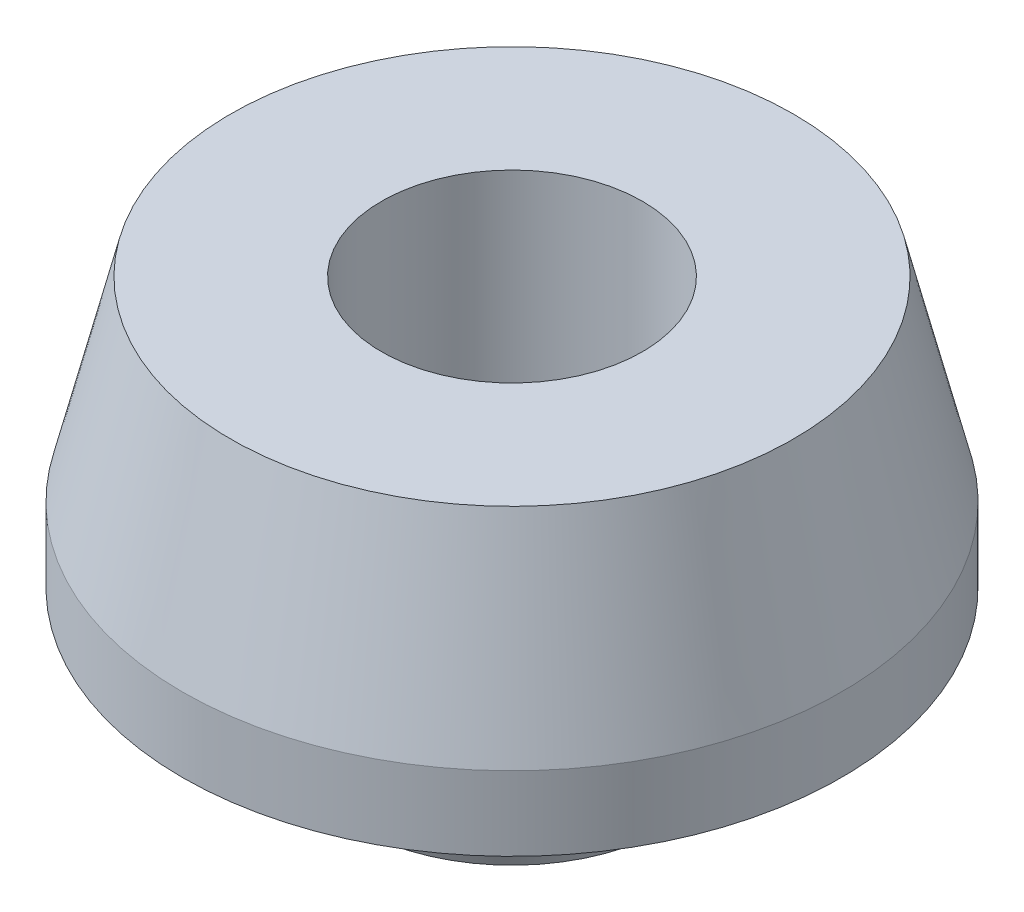
ISO-10303-21;
HEADER;
FILE_DESCRIPTION(('STEP AP214'),'2;1');
FILE_NAME('part.step','',(''),(''),'','','');
FILE_SCHEMA(('AUTOMOTIVE_DESIGN { 1 0 10303 214 1 1 1 1 }'));
ENDSEC;
DATA;
#1=APPLICATION_CONTEXT('core data for automotive mechanical design processes');
#2=APPLICATION_PROTOCOL_DEFINITION('international standard','automotive_design',2000,#1);
#3=PRODUCT_CONTEXT('',#1,'mechanical');
#4=PRODUCT('Part','Part','',(#3));
#5=PRODUCT_RELATED_PRODUCT_CATEGORY('part','',(#4));
#6=PRODUCT_DEFINITION_FORMATION('','',#4);
#7=PRODUCT_DEFINITION_CONTEXT('part definition',#1,'design');
#8=PRODUCT_DEFINITION('design','',#6,#7);
#9=PRODUCT_DEFINITION_SHAPE('','',#8);
#10=(LENGTH_UNIT() NAMED_UNIT(*) SI_UNIT(.MILLI.,.METRE.));
#11=(NAMED_UNIT(*) PLANE_ANGLE_UNIT() SI_UNIT($,.RADIAN.));
#12=(NAMED_UNIT(*) SI_UNIT($,.STERADIAN.) SOLID_ANGLE_UNIT());
#13=UNCERTAINTY_MEASURE_WITH_UNIT(LENGTH_MEASURE(1.E-05),#10,'distance_accuracy_value','');
#14=(GEOMETRIC_REPRESENTATION_CONTEXT(3) GLOBAL_UNCERTAINTY_ASSIGNED_CONTEXT((#13)) GLOBAL_UNIT_ASSIGNED_CONTEXT((#10,
#11,#12)) REPRESENTATION_CONTEXT('',''));
#15=CARTESIAN_POINT('',(0.,0.,0.));
#16=DIRECTION('',(0.,0.,1.));
#17=DIRECTION('',(1.,0.,0.));
#18=AXIS2_PLACEMENT_3D('',#15,#16,#17);
#19=CARTESIAN_POINT('',(5.75,1.98027515278161,0.));
#20=DIRECTION('',(0.,-1.,0.));
#21=DIRECTION('',(0.,0.,-1.));
#22=AXIS2_PLACEMENT_3D('',#19,#20,#21);
#23=PLANE('',#22);
#24=CARTESIAN_POINT('',(0.,1.98027515278161,0.));
#25=DIRECTION('',(0.,-1.,0.));
#26=DIRECTION('',(0.,0.,-1.));
#27=AXIS2_PLACEMENT_3D('',#24,#25,#26);
#28=CIRCLE('',#27,5.75);
#29=CARTESIAN_POINT('',(0.,1.98027515278161,-5.75));
#30=VERTEX_POINT('',#29);
#31=EDGE_CURVE('E56',#30,#30,#28,.T.);
#32=ORIENTED_EDGE('',*,*,#31,.T.);
#33=EDGE_LOOP('',(#32));
#34=FACE_BOUND('',#33,.T.);
#35=CARTESIAN_POINT('',(0.,1.98027515278161,0.));
#36=DIRECTION('',(0.,-1.,0.));
#37=DIRECTION('',(0.,0.,-1.));
#38=AXIS2_PLACEMENT_3D('',#35,#36,#37);
#39=CIRCLE('',#38,4.75);
#40=CARTESIAN_POINT('',(0.,1.98027515278161,-4.75));
#41=VERTEX_POINT('',#40);
#42=EDGE_CURVE('E10',#41,#41,#39,.T.);
#43=ORIENTED_EDGE('',*,*,#42,.F.);
#44=EDGE_LOOP('',(#43));
#45=FACE_BOUND('',#44,.T.);
#46=ADVANCED_FACE('F31',(#34,#45),#23,.T.);
#47=CARTESIAN_POINT('',(0.,0.,0.));
#48=DIRECTION('',(0.,-1.,0.));
#49=DIRECTION('',(0.,0.,-1.));
#50=AXIS2_PLACEMENT_3D('',#47,#48,#49);
#51=CYLINDRICAL_SURFACE('',#50,4.75);
#52=ORIENTED_EDGE('',*,*,#42,.T.);
#53=EDGE_LOOP('',(#52));
#54=FACE_BOUND('',#53,.T.);
#55=CARTESIAN_POINT('',(0.,16.4802751527816,0.));
#56=DIRECTION('',(0.,-1.,0.));
#57=DIRECTION('',(0.,0.,-1.));
#58=AXIS2_PLACEMENT_3D('',#55,#56,#57);
#59=CIRCLE('',#58,4.75);
#60=CARTESIAN_POINT('',(0.,16.4802751527816,-4.75));
#61=VERTEX_POINT('',#60);
#62=EDGE_CURVE('E37',#61,#61,#59,.T.);
#63=ORIENTED_EDGE('',*,*,#62,.F.);
#64=EDGE_LOOP('',(#63));
#65=FACE_BOUND('',#64,.T.);
#66=ADVANCED_FACE('F74',(#54,#65),#51,.F.);
#67=CARTESIAN_POINT('',(4.75,16.4802751527816,0.));
#68=DIRECTION('',(0.,1.,0.));
#69=DIRECTION('',(0.,0.,1.));
#70=AXIS2_PLACEMENT_3D('',#67,#68,#69);
#71=PLANE('',#70);
#72=ORIENTED_EDGE('',*,*,#62,.T.);
#73=EDGE_LOOP('',(#72));
#74=FACE_BOUND('',#73,.T.);
#75=CARTESIAN_POINT('',(0.,16.4802751527816,0.));
#76=DIRECTION('',(0.,-1.,0.));
#77=DIRECTION('',(0.,0.,-1.));
#78=AXIS2_PLACEMENT_3D('',#75,#76,#77);
#79=CIRCLE('',#78,10.25);
#80=CARTESIAN_POINT('',(0.,16.4802751527816,-10.25));
#81=VERTEX_POINT('',#80);
#82=EDGE_CURVE('E41',#81,#81,#79,.T.);
#83=ORIENTED_EDGE('',*,*,#82,.F.);
#84=EDGE_LOOP('',(#83));
#85=FACE_BOUND('',#84,.T.);
#86=ADVANCED_FACE('F78',(#74,#85),#71,.T.);
#87=CARTESIAN_POINT('',(0.,9.38027515278161,0.));
#88=DIRECTION('',(0.,-1.,0.));
#89=DIRECTION('',(0.,0.,-1.));
#90=AXIS2_PLACEMENT_3D('',#87,#88,#89);
#91=CONICAL_SURFACE('',#90,12.,0.241661925703708);
#92=ORIENTED_EDGE('',*,*,#82,.T.);
#93=EDGE_LOOP('',(#92));
#94=FACE_BOUND('',#93,.T.);
#95=CARTESIAN_POINT('',(0.,9.38027515278161,0.));
#96=DIRECTION('',(0.,-1.,0.));
#97=DIRECTION('',(0.,0.,-1.));
#98=AXIS2_PLACEMENT_3D('',#95,#96,#97);
#99=CIRCLE('',#98,12.);
#100=CARTESIAN_POINT('',(0.,9.38027515278161,-12.));
#101=VERTEX_POINT('',#100);
#102=EDGE_CURVE('E45',#101,#101,#99,.T.);
#103=ORIENTED_EDGE('',*,*,#102,.F.);
#104=EDGE_LOOP('',(#103));
#105=FACE_BOUND('',#104,.T.);
#106=ADVANCED_FACE('F82',(#94,#105),#91,.T.);
#107=CARTESIAN_POINT('',(0.,0.,0.));
#108=DIRECTION('',(0.,-1.,0.));
#109=DIRECTION('',(0.,0.,-1.));
#110=AXIS2_PLACEMENT_3D('',#107,#108,#109);
#111=CYLINDRICAL_SURFACE('',#110,12.);
#112=ORIENTED_EDGE('',*,*,#102,.T.);
#113=EDGE_LOOP('',(#112));
#114=FACE_BOUND('',#113,.T.);
#115=CARTESIAN_POINT('',(0.,6.68027515278161,0.));
#116=DIRECTION('',(0.,-1.,0.));
#117=DIRECTION('',(0.,0.,-1.));
#118=AXIS2_PLACEMENT_3D('',#115,#116,#117);
#119=CIRCLE('',#118,12.);
#120=CARTESIAN_POINT('',(0.,6.68027515278161,-12.));
#121=VERTEX_POINT('',#120);
#122=EDGE_CURVE('E50',#121,#121,#119,.T.);
#123=ORIENTED_EDGE('',*,*,#122,.F.);
#124=EDGE_LOOP('',(#123));
#125=FACE_BOUND('',#124,.T.);
#126=ADVANCED_FACE('F70',(#114,#125),#111,.T.);
#127=CARTESIAN_POINT('',(12.,6.68027515278161,0.));
#128=DIRECTION('',(0.,-1.,0.));
#129=DIRECTION('',(0.,0.,-1.));
#130=AXIS2_PLACEMENT_3D('',#127,#128,#129);
#131=PLANE('',#130);
#132=ORIENTED_EDGE('',*,*,#122,.T.);
#133=EDGE_LOOP('',(#132));
#134=FACE_BOUND('',#133,.T.);
#135=CARTESIAN_POINT('',(0.,6.68027515278161,0.));
#136=DIRECTION('',(0.,-1.,0.));
#137=DIRECTION('',(0.,0.,-1.));
#138=AXIS2_PLACEMENT_3D('',#135,#136,#137);
#139=CIRCLE('',#138,7.25);
#140=CARTESIAN_POINT('',(0.,6.68027515278161,-7.25));
#141=VERTEX_POINT('',#140);
#142=EDGE_CURVE('E53',#141,#141,#139,.T.);
#143=ORIENTED_EDGE('',*,*,#142,.F.);
#144=EDGE_LOOP('',(#143));
#145=FACE_BOUND('',#144,.T.);
#146=ADVANCED_FACE('F64',(#134,#145),#131,.T.);
#147=CARTESIAN_POINT('',(0.,1.98027515278161,0.));
#148=DIRECTION('',(0.,1.,0.));
#149=DIRECTION('',(0.,0.,1.));
#150=AXIS2_PLACEMENT_3D('',#147,#148,#149);
#151=CONICAL_SURFACE('',#150,5.75,0.308930743923742);
#152=ORIENTED_EDGE('',*,*,#142,.T.);
#153=EDGE_LOOP('',(#152));
#154=FACE_BOUND('',#153,.T.);
#155=ORIENTED_EDGE('',*,*,#31,.F.);
#156=EDGE_LOOP('',(#155));
#157=FACE_BOUND('',#156,.T.);
#158=ADVANCED_FACE('F62',(#154,#157),#151,.T.);
#159=CLOSED_SHELL('',(#46,#66,#86,#106,#126,#146,#158));
#160=MANIFOLD_SOLID_BREP('B2',#159);
#161=ADVANCED_BREP_SHAPE_REPRESENTATION('',(#18,#160),#14);
#162=SHAPE_DEFINITION_REPRESENTATION(#9,#161);
ENDSEC;
END-ISO-10303-21;
